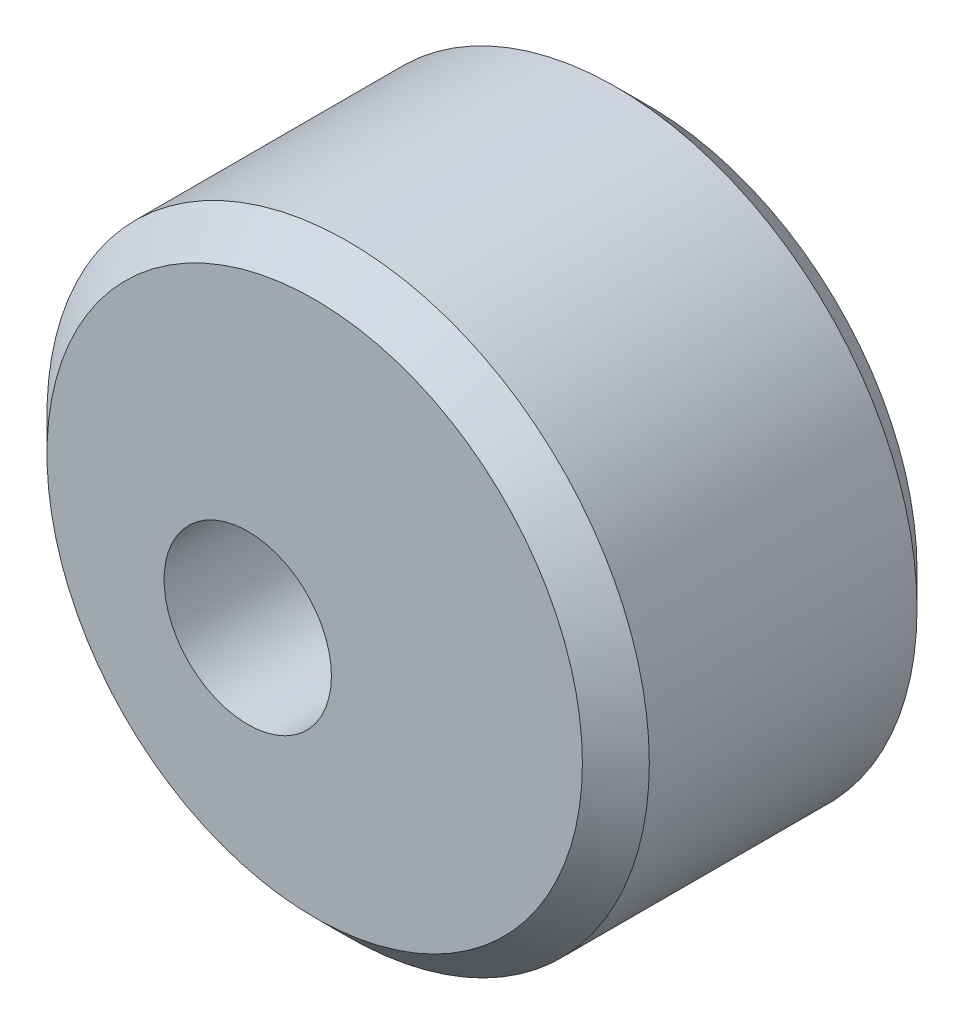
ISO-10303-21;
HEADER;
FILE_DESCRIPTION(('STEP AP214'),'2;1');
FILE_NAME('part.step','',(''),(''),'','','');
FILE_SCHEMA(('AUTOMOTIVE_DESIGN { 1 0 10303 214 1 1 1 1 }'));
ENDSEC;
DATA;
#1=APPLICATION_CONTEXT('core data for automotive mechanical design processes');
#2=APPLICATION_PROTOCOL_DEFINITION('international standard','automotive_design',2000,#1);
#3=PRODUCT_CONTEXT('',#1,'mechanical');
#4=PRODUCT('Part','Part','',(#3));
#5=PRODUCT_RELATED_PRODUCT_CATEGORY('part','',(#4));
#6=PRODUCT_DEFINITION_FORMATION('','',#4);
#7=PRODUCT_DEFINITION_CONTEXT('part definition',#1,'design');
#8=PRODUCT_DEFINITION('design','',#6,#7);
#9=PRODUCT_DEFINITION_SHAPE('','',#8);
#10=(LENGTH_UNIT() NAMED_UNIT(*) SI_UNIT(.MILLI.,.METRE.));
#11=(NAMED_UNIT(*) PLANE_ANGLE_UNIT() SI_UNIT($,.RADIAN.));
#12=(NAMED_UNIT(*) SI_UNIT($,.STERADIAN.) SOLID_ANGLE_UNIT());
#13=UNCERTAINTY_MEASURE_WITH_UNIT(LENGTH_MEASURE(1.E-05),#10,'distance_accuracy_value','');
#14=(GEOMETRIC_REPRESENTATION_CONTEXT(3) GLOBAL_UNCERTAINTY_ASSIGNED_CONTEXT((#13)) GLOBAL_UNIT_ASSIGNED_CONTEXT((#10,
#11,#12)) REPRESENTATION_CONTEXT('',''));
#15=CARTESIAN_POINT('',(0.,0.,0.));
#16=DIRECTION('',(0.,0.,1.));
#17=DIRECTION('',(1.,0.,0.));
#18=AXIS2_PLACEMENT_3D('',#15,#16,#17);
#19=CARTESIAN_POINT('',(0.,0.,5.));
#20=DIRECTION('',(0.,0.,-1.));
#21=DIRECTION('',(-1.,0.,0.));
#22=AXIS2_PLACEMENT_3D('',#19,#20,#21);
#23=CYLINDRICAL_SURFACE('',#22,9.);
#24=CARTESIAN_POINT('',(-1.80433852761559,-8.81727636392112,-1.45400557927042));
#25=CARTESIAN_POINT('',(-1.88305567786452,-8.80116982019875,-1.33064119675965));
#26=CARTESIAN_POINT('',(-1.95119602782157,-8.78613886378013,-1.20025134051409));
#27=CARTESIAN_POINT('',(-2.06522027440107,-8.76004021141302,-0.929571282495707));
#28=CARTESIAN_POINT('',(-2.11106773899933,-8.74897901068899,-0.789265300989391));
#29=CARTESIAN_POINT('',(-2.17983142507428,-8.73210174628504,-0.50234966398677));
#30=CARTESIAN_POINT('',(-2.20267337711645,-8.72630267644006,-0.355721175763164));
#31=CARTESIAN_POINT('',(-2.22478559133746,-8.7206915369399,-0.0606495912894167));
#32=CARTESIAN_POINT('',(-2.22406436510074,-8.72087730541742,0.0877928303560226));
#33=CARTESIAN_POINT('',(-2.19877083831716,-8.72728961852591,0.386265467062395));
#34=CARTESIAN_POINT('',(-2.1736015647286,-8.73366735693675,0.536242319114515));
#35=CARTESIAN_POINT('',(-2.09893350771893,-8.75191081724008,0.829720936953822));
#36=CARTESIAN_POINT('',(-2.0494280943087,-8.76377803460062,0.973220926585999));
#37=CARTESIAN_POINT('',(-1.92721153673114,-8.79145872024332,1.24860710194774));
#38=CARTESIAN_POINT('',(-1.85463491187257,-8.8072491997401,1.38055509182715));
#39=CARTESIAN_POINT('',(-1.68728075699007,-8.84083379539718,1.62934672153824));
#40=CARTESIAN_POINT('',(-1.59250477331009,-8.85862777195478,1.74619141254324));
#41=CARTESIAN_POINT('',(-1.3879250355449,-8.89290936522055,1.95437640094459));
#42=CARTESIAN_POINT('',(-1.27915680942671,-8.90941684550858,2.04672580216072));
#43=CARTESIAN_POINT('',(-1.04562824792047,-8.93982332400363,2.20891807046701));
#44=CARTESIAN_POINT('',(-0.920886491238166,-8.9537253070867,2.27878675824148));
#45=CARTESIAN_POINT('',(-0.675217371776399,-8.97537687710028,2.38477339686255));
#46=CARTESIAN_POINT('',(-0.55566254997022,-8.98366818081286,2.42395716862481));
#47=CARTESIAN_POINT('',(-0.311110268640582,-8.99545040199411,2.4791364276092));
#48=CARTESIAN_POINT('',(-0.186118149789795,-8.99894592488099,2.49515416212301));
#49=CARTESIAN_POINT('',(0.0498852042082492,-9.00054423150455,2.50250059433385));
#50=CARTESIAN_POINT('',(0.160817617035056,-8.99923118259891,2.49650352712726));
#51=CARTESIAN_POINT('',(0.379966172002285,-8.99264345280511,2.46599234396176));
#52=CARTESIAN_POINT('',(0.488182587653152,-8.98736917249453,2.44148010033948));
#53=CARTESIAN_POINT('',(0.696985597135573,-8.97357120515936,2.37581265851172));
#54=CARTESIAN_POINT('',(0.797675411718508,-8.96510859455795,2.33496945048857));
#55=CARTESIAN_POINT('',(0.991378471042835,-8.94576202118623,2.23842495772335));
#56=CARTESIAN_POINT('',(1.08438975146527,-8.93487744144436,2.18271988635466));
#57=CARTESIAN_POINT('',(1.26845662953356,-8.91068698956733,2.05327909869054));
#58=CARTESIAN_POINT('',(1.35871190343583,-8.89725523161844,1.97843198357766));
#59=CARTESIAN_POINT('',(1.52698061401597,-8.8699274012373,1.81614427254022));
#60=CARTESIAN_POINT('',(1.60498822606808,-8.8560311116749,1.72869772237821));
#61=CARTESIAN_POINT('',(1.75668327556626,-8.82727311547367,1.5320854671812));
#62=CARTESIAN_POINT('',(1.82864210353498,-8.81250468162039,1.42157118074255));
#63=CARTESIAN_POINT('',(1.95503870995189,-8.78532926201643,1.19067622103594));
#64=CARTESIAN_POINT('',(2.00946885869251,-8.77292330553875,1.07029127989414));
#65=CARTESIAN_POINT('',(2.10457675916332,-8.75062237727042,0.810467745394678));
#66=CARTESIAN_POINT('',(2.14339840641424,-8.74108971936369,0.670315435453081));
#67=CARTESIAN_POINT('',(2.19856680257011,-8.72737724654931,0.385400034448048));
#68=CARTESIAN_POINT('',(2.21490888505951,-8.72319854305347,0.240635992438527));
#69=CARTESIAN_POINT('',(2.22505367539215,-8.72061793925931,-0.0555150146118313));
#70=CARTESIAN_POINT('',(2.2179350259386,-8.7224521658779,-0.206936587443088));
#71=CARTESIAN_POINT('',(2.17922775790311,-8.73220221290203,-0.506439252865383));
#72=CARTESIAN_POINT('',(2.14763569205205,-8.74011889006626,-0.65451987183305));
#73=CARTESIAN_POINT('',(2.06034130862615,-8.76110762476807,-0.9435946437535));
#74=CARTESIAN_POINT('',(2.00455618518422,-8.77419737446485,-1.08456258535204));
#75=CARTESIAN_POINT('',(1.86969592522304,-8.8039188664876,-1.35455998254163));
#76=CARTESIAN_POINT('',(1.7906177851818,-8.82055106551865,-1.48358789570226));
#77=CARTESIAN_POINT('',(1.61311276869306,-8.8547035780601,-1.72150859248651));
#78=CARTESIAN_POINT('',(1.51532941463656,-8.8721829128286,-1.83088511387372));
#79=CARTESIAN_POINT('',(1.30081324975129,-8.90615617091267,-2.02940826170186));
#80=CARTESIAN_POINT('',(1.18409456332928,-8.92265081628624,-2.11856984909317));
#81=CARTESIAN_POINT('',(0.947029825082395,-8.95075022839222,-2.26418619707949));
#82=CARTESIAN_POINT('',(0.828176601573587,-8.96267680364017,-2.3229992726788));
#83=CARTESIAN_POINT('',(0.581063488845858,-8.98207291899927,-2.41668344985258));
#84=CARTESIAN_POINT('',(0.452815629405923,-8.98954805088095,-2.4515845972139));
#85=CARTESIAN_POINT('',(0.209040581011064,-8.99828767005829,-2.4921741484777));
#86=CARTESIAN_POINT('',(0.0940725831620024,-9.00024246223114,-2.50111404022933));
#87=CARTESIAN_POINT('',(-0.135616480462659,-8.9997095966287,-2.49866542562152));
#88=CARTESIAN_POINT('',(-0.250337622559253,-8.997223601427,-2.48728452710482));
#89=CARTESIAN_POINT('',(-0.4690214816002,-8.98839746545754,-2.44617128745208));
#90=CARTESIAN_POINT('',(-0.573214986071875,-8.98229985095628,-2.41759205777943));
#91=CARTESIAN_POINT('',(-0.775600603901383,-8.96709279926209,-2.34446465254218));
#92=CARTESIAN_POINT('',(-0.873790772623576,-8.95798239220825,-2.29991133430116));
#93=CARTESIAN_POINT('',(-1.06697280451537,-8.93708569327108,-2.1939910953221));
#94=CARTESIAN_POINT('',(-1.161540545174,-8.92518588901804,-2.13187737356718));
#95=CARTESIAN_POINT('',(-1.34011232201086,-8.90012569122441,-1.99430303696731));
#96=CARTESIAN_POINT('',(-1.42412041448426,-8.8869657851723,-1.91884757407889));
#97=CARTESIAN_POINT('',(-1.55892244583255,-8.86414486303332,-1.77918614181025));
#98=CARTESIAN_POINT('',(-1.6124887089463,-8.85451929940273,-1.7176125224311));
#99=CARTESIAN_POINT('',(-1.71324632997503,-8.83557641708789,-1.58942305061617));
#100=CARTESIAN_POINT('',(-1.76043732471199,-8.82625911598715,-1.52280691126167));
#101=CARTESIAN_POINT('',(-1.80433852761559,-8.81727636392112,-1.45400557927042));
#102=B_SPLINE_CURVE_WITH_KNOTS('',3,(#24,#25,#26,#27,#28,#29,#30,#31,#32,#33,#34,#35,#36,#37,
#38,#39,#40,#41,#42,#43,#44,#45,#46,#47,#48,#49,#50,#51,#52,#53,#54,#55,#56,#57,#58,#59,#60,#61,
#62,#63,#64,#65,#66,#67,#68,#69,#70,#71,#72,#73,#74,#75,#76,#77,#78,#79,#80,#81,#82,#83,#84,#85,
#86,#87,#88,#89,#90,#91,#92,#93,#94,#95,#96,#97,#98,#99,#100,#101),.UNSPECIFIED.,.T.,.F.,(4,2,2,
2,2,2,2,2,2,2,2,2,2,2,2,2,2,2,2,2,2,2,2,2,2,2,2,2,2,2,2,2,2,2,2,2,2,2,4),(0.,0.441366180523458,
0.883451257051981,1.3269589998947,1.77030653888847,2.22475911836539,2.67933557479542,
3.1313087410039,3.58325043341001,4.01173095147469,4.43971755795769,4.81579237615409,
5.19150579397926,5.52317308942371,5.85480684969211,6.1803865512704,6.50604928604901,
6.858690451924,7.21149881882106,7.60795787895394,8.00458927329533,8.43985672217728,
8.87521451232937,9.32787038988236,9.780590039097,10.2348715999637,10.6892117639055,
11.1300748265665,11.570610536247,11.9677022218413,12.364294034673,12.7084658369852,
13.0525088128143,13.3757163978373,13.6990281294409,14.0389657471647,14.3787723824204,
14.6249119199529,14.8710654733358),.UNSPECIFIED.);
#103=CARTESIAN_POINT('',(-1.80433852761559,-8.81727636392112,-1.45400557927042));
#104=VERTEX_POINT('',#103);
#105=EDGE_CURVE('E11',#104,#104,#102,.T.);
#106=ORIENTED_EDGE('',*,*,#105,.T.);
#107=EDGE_LOOP('',(#106));
#108=FACE_BOUND('',#107,.T.);
#109=CARTESIAN_POINT('',(0.,0.,-4.));
#110=DIRECTION('',(0.,0.,1.));
#111=DIRECTION('',(1.,0.,0.));
#112=AXIS2_PLACEMENT_3D('',#109,#110,#111);
#113=CIRCLE('',#112,9.);
#114=CARTESIAN_POINT('',(9.,0.,-4.));
#115=VERTEX_POINT('',#114);
#116=EDGE_CURVE('E75',#115,#115,#113,.T.);
#117=ORIENTED_EDGE('',*,*,#116,.T.);
#118=EDGE_LOOP('',(#117));
#119=FACE_BOUND('',#118,.T.);
#120=CARTESIAN_POINT('',(0.,0.,4.));
#121=DIRECTION('',(0.,0.,1.));
#122=DIRECTION('',(1.,0.,0.));
#123=AXIS2_PLACEMENT_3D('',#120,#121,#122);
#124=CIRCLE('',#123,9.);
#125=CARTESIAN_POINT('',(9.,0.,4.));
#126=VERTEX_POINT('',#125);
#127=EDGE_CURVE('E78',#126,#126,#124,.F.);
#128=ORIENTED_EDGE('',*,*,#127,.T.);
#129=EDGE_LOOP('',(#128));
#130=FACE_BOUND('',#129,.T.);
#131=ADVANCED_FACE('F47',(#108,#119,#130),#23,.T.);
#132=CARTESIAN_POINT('',(0.,0.,5.));
#133=DIRECTION('',(0.,0.,1.));
#134=DIRECTION('',(1.,0.,0.));
#135=AXIS2_PLACEMENT_3D('',#132,#133,#134);
#136=PLANE('',#135);
#137=CARTESIAN_POINT('',(-2.,-1.5,5.));
#138=DIRECTION('',(0.,0.,1.));
#139=DIRECTION('',(1.,0.,0.));
#140=AXIS2_PLACEMENT_3D('',#137,#138,#139);
#141=CIRCLE('',#140,2.5);
#142=CARTESIAN_POINT('',(0.499999999999999,-1.5,5.));
#143=VERTEX_POINT('',#142);
#144=EDGE_CURVE('E85',#143,#143,#141,.T.);
#145=ORIENTED_EDGE('',*,*,#144,.F.);
#146=EDGE_LOOP('',(#145));
#147=FACE_BOUND('',#146,.T.);
#148=CARTESIAN_POINT('',(0.,0.,5.));
#149=DIRECTION('',(0.,0.,1.));
#150=DIRECTION('',(1.,0.,0.));
#151=AXIS2_PLACEMENT_3D('',#148,#149,#150);
#152=CIRCLE('',#151,8.);
#153=CARTESIAN_POINT('',(8.,0.,5.));
#154=VERTEX_POINT('',#153);
#155=EDGE_CURVE('E60',#154,#154,#152,.T.);
#156=ORIENTED_EDGE('',*,*,#155,.T.);
#157=EDGE_LOOP('',(#156));
#158=FACE_BOUND('',#157,.T.);
#159=ADVANCED_FACE('F71',(#147,#158),#136,.T.);
#160=CARTESIAN_POINT('',(0.,0.,-5.));
#161=DIRECTION('',(0.,0.,1.));
#162=DIRECTION('',(1.,0.,0.));
#163=AXIS2_PLACEMENT_3D('',#160,#161,#162);
#164=PLANE('',#163);
#165=CARTESIAN_POINT('',(-2.,-1.5,-5.));
#166=DIRECTION('',(0.,0.,1.));
#167=DIRECTION('',(1.,0.,0.));
#168=AXIS2_PLACEMENT_3D('',#165,#166,#167);
#169=CIRCLE('',#168,2.5);
#170=CARTESIAN_POINT('',(0.499999999999998,-1.5,-5.));
#171=VERTEX_POINT('',#170);
#172=EDGE_CURVE('E80',#171,#171,#169,.T.);
#173=ORIENTED_EDGE('',*,*,#172,.T.);
#174=EDGE_LOOP('',(#173));
#175=FACE_BOUND('',#174,.T.);
#176=CARTESIAN_POINT('',(0.,0.,-5.));
#177=DIRECTION('',(0.,0.,1.));
#178=DIRECTION('',(1.,0.,0.));
#179=AXIS2_PLACEMENT_3D('',#176,#177,#178);
#180=CIRCLE('',#179,7.99999999999999);
#181=CARTESIAN_POINT('',(7.99999999999999,0.,-5.));
#182=VERTEX_POINT('',#181);
#183=EDGE_CURVE('E82',#182,#182,#180,.F.);
#184=ORIENTED_EDGE('',*,*,#183,.T.);
#185=EDGE_LOOP('',(#184));
#186=FACE_BOUND('',#185,.T.);
#187=ADVANCED_FACE('F103',(#175,#186),#164,.F.);
#188=CARTESIAN_POINT('',(0.,0.,-4.));
#189=DIRECTION('',(0.,0.,1.));
#190=DIRECTION('',(1.,0.,0.));
#191=AXIS2_PLACEMENT_3D('',#188,#189,#190);
#192=CONICAL_SURFACE('',#191,9.,0.785398163397451);
#193=ORIENTED_EDGE('',*,*,#183,.F.);
#194=EDGE_LOOP('',(#193));
#195=FACE_BOUND('',#194,.T.);
#196=ORIENTED_EDGE('',*,*,#116,.F.);
#197=EDGE_LOOP('',(#196));
#198=FACE_BOUND('',#197,.T.);
#199=ADVANCED_FACE('F95',(#195,#198),#192,.T.);
#200=CARTESIAN_POINT('',(0.,0.,5.));
#201=DIRECTION('',(0.,0.,-1.));
#202=DIRECTION('',(-1.,0.,0.));
#203=AXIS2_PLACEMENT_3D('',#200,#201,#202);
#204=CONICAL_SURFACE('',#203,8.,0.785398163397447);
#205=ORIENTED_EDGE('',*,*,#127,.F.);
#206=EDGE_LOOP('',(#205));
#207=FACE_BOUND('',#206,.T.);
#208=ORIENTED_EDGE('',*,*,#155,.F.);
#209=EDGE_LOOP('',(#208));
#210=FACE_BOUND('',#209,.T.);
#211=ADVANCED_FACE('F50',(#207,#210),#204,.T.);
#212=CARTESIAN_POINT('',(-2.,-1.5,5.));
#213=DIRECTION('',(0.,0.,1.));
#214=DIRECTION('',(1.,0.,0.));
#215=AXIS2_PLACEMENT_3D('',#212,#213,#214);
#216=CYLINDRICAL_SURFACE('',#215,2.5);
#217=ORIENTED_EDGE('',*,*,#172,.F.);
#218=EDGE_LOOP('',(#217));
#219=FACE_BOUND('',#218,.T.);
#220=ORIENTED_EDGE('',*,*,#144,.T.);
#221=EDGE_LOOP('',(#220));
#222=FACE_BOUND('',#221,.T.);
#223=ADVANCED_FACE('F66',(#219,#222),#216,.F.);
#224=CARTESIAN_POINT('',(0.,-9.,0.));
#225=DIRECTION('',(0.,-1.,0.));
#226=DIRECTION('',(0.,0.,-1.));
#227=AXIS2_PLACEMENT_3D('',#224,#225,#226);
#228=CONICAL_SURFACE('',#227,2.5,0.785398163397457);
#229=CARTESIAN_POINT('',(0.,-6.50000000000004,0.));
#230=VERTEX_POINT('',#229);
#231=VERTEX_LOOP('',#230);
#232=FACE_BOUND('',#231,.T.);
#233=ORIENTED_EDGE('',*,*,#105,.F.);
#234=EDGE_LOOP('',(#233));
#235=FACE_BOUND('',#234,.T.);
#236=ADVANCED_FACE('F63',(#232,#235),#228,.F.);
#237=CLOSED_SHELL('',(#131,#159,#187,#199,#211,#223,#236));
#238=MANIFOLD_SOLID_BREP('B2',#237);
#239=ADVANCED_BREP_SHAPE_REPRESENTATION('',(#18,#238),#14);
#240=SHAPE_DEFINITION_REPRESENTATION(#9,#239);
ENDSEC;
END-ISO-10303-21;
